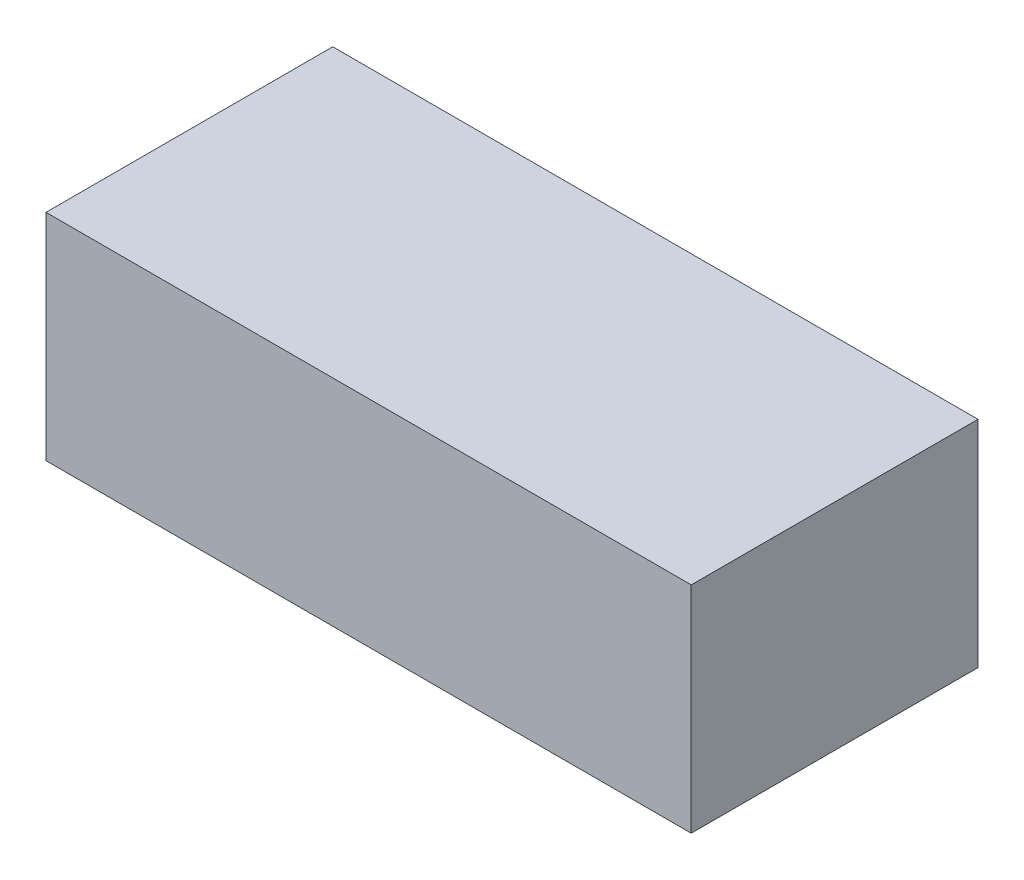
ISO-10303-21;
HEADER;
FILE_DESCRIPTION(('STEP AP214'),'2;1');
FILE_NAME('part.step','',(''),(''),'','','');
FILE_SCHEMA(('AUTOMOTIVE_DESIGN { 1 0 10303 214 1 1 1 1 }'));
ENDSEC;
DATA;
#1=APPLICATION_CONTEXT('core data for automotive mechanical design processes');
#2=APPLICATION_PROTOCOL_DEFINITION('international standard','automotive_design',2000,#1);
#3=PRODUCT_CONTEXT('',#1,'mechanical');
#4=PRODUCT('Part','Part','',(#3));
#5=PRODUCT_RELATED_PRODUCT_CATEGORY('part','',(#4));
#6=PRODUCT_DEFINITION_FORMATION('','',#4);
#7=PRODUCT_DEFINITION_CONTEXT('part definition',#1,'design');
#8=PRODUCT_DEFINITION('design','',#6,#7);
#9=PRODUCT_DEFINITION_SHAPE('','',#8);
#10=(LENGTH_UNIT() NAMED_UNIT(*) SI_UNIT(.MILLI.,.METRE.));
#11=(NAMED_UNIT(*) PLANE_ANGLE_UNIT() SI_UNIT($,.RADIAN.));
#12=(NAMED_UNIT(*) SI_UNIT($,.STERADIAN.) SOLID_ANGLE_UNIT());
#13=UNCERTAINTY_MEASURE_WITH_UNIT(LENGTH_MEASURE(1.E-05),#10,'distance_accuracy_value','');
#14=(GEOMETRIC_REPRESENTATION_CONTEXT(3) GLOBAL_UNCERTAINTY_ASSIGNED_CONTEXT((#13)) GLOBAL_UNIT_ASSIGNED_CONTEXT((#10,
#11,#12)) REPRESENTATION_CONTEXT('',''));
#15=CARTESIAN_POINT('',(0.,0.,0.));
#16=DIRECTION('',(0.,0.,1.));
#17=DIRECTION('',(1.,0.,0.));
#18=AXIS2_PLACEMENT_3D('',#15,#16,#17);
#19=CARTESIAN_POINT('',(-776.612903225806,600.,-268.548387096774));
#20=DIRECTION('',(1.,0.,0.));
#21=DIRECTION('',(0.,0.,-1.));
#22=AXIS2_PLACEMENT_3D('',#19,#20,#21);
#23=PLANE('',#22);
#24=DIRECTION('',(0.,0.,1.));
#25=VECTOR('',#24,1.);
#26=CARTESIAN_POINT('',(-776.612903225806,0.,-268.548387096774));
#27=LINE('',#26,#25);
#28=CARTESIAN_POINT('',(-776.612903225806,0.,-268.548387096774));
#29=VERTEX_POINT('',#28);
#30=CARTESIAN_POINT('',(-776.612903225806,0.,531.451612903226));
#31=VERTEX_POINT('',#30);
#32=EDGE_CURVE('E107',#29,#31,#27,.T.);
#33=ORIENTED_EDGE('',*,*,#32,.T.);
#34=DIRECTION('',(0.,-1.,0.));
#35=VECTOR('',#34,1.);
#36=CARTESIAN_POINT('',(-776.612903225806,600.,531.451612903226));
#37=LINE('',#36,#35);
#38=CARTESIAN_POINT('',(-776.612903225806,600.,531.451612903226));
#39=VERTEX_POINT('',#38);
#40=EDGE_CURVE('E11',#39,#31,#37,.T.);
#41=ORIENTED_EDGE('',*,*,#40,.F.);
#42=DIRECTION('',(0.,0.,1.));
#43=VECTOR('',#42,1.);
#44=CARTESIAN_POINT('',(-776.612903225806,600.,-268.548387096774));
#45=LINE('',#44,#43);
#46=CARTESIAN_POINT('',(-776.612903225806,600.,-268.548387096774));
#47=VERTEX_POINT('',#46);
#48=EDGE_CURVE('E91',#47,#39,#45,.T.);
#49=ORIENTED_EDGE('',*,*,#48,.F.);
#50=DIRECTION('',(0.,-1.,0.));
#51=VECTOR('',#50,1.);
#52=CARTESIAN_POINT('',(-776.612903225806,600.,-268.548387096774));
#53=LINE('',#52,#51);
#54=EDGE_CURVE('E103',#47,#29,#53,.T.);
#55=ORIENTED_EDGE('',*,*,#54,.T.);
#56=EDGE_LOOP('',(#33,#41,#49,#55));
#57=FACE_BOUND('',#56,.T.);
#58=ADVANCED_FACE('F39',(#57),#23,.F.);
#59=CARTESIAN_POINT('',(-776.612903225806,600.,531.451612903226));
#60=DIRECTION('',(0.,0.,-1.));
#61=DIRECTION('',(-1.,0.,0.));
#62=AXIS2_PLACEMENT_3D('',#59,#60,#61);
#63=PLANE('',#62);
#64=DIRECTION('',(1.,0.,0.));
#65=VECTOR('',#64,1.);
#66=CARTESIAN_POINT('',(-776.612903225806,0.,531.451612903226));
#67=LINE('',#66,#65);
#68=CARTESIAN_POINT('',(1023.38709677419,0.,531.451612903226));
#69=VERTEX_POINT('',#68);
#70=EDGE_CURVE('E96',#31,#69,#67,.T.);
#71=ORIENTED_EDGE('',*,*,#70,.T.);
#72=DIRECTION('',(0.,-1.,0.));
#73=VECTOR('',#72,1.);
#74=CARTESIAN_POINT('',(1023.38709677419,600.,531.451612903226));
#75=LINE('',#74,#73);
#76=CARTESIAN_POINT('',(1023.38709677419,600.,531.451612903226));
#77=VERTEX_POINT('',#76);
#78=EDGE_CURVE('E48',#77,#69,#75,.T.);
#79=ORIENTED_EDGE('',*,*,#78,.F.);
#80=DIRECTION('',(1.,0.,0.));
#81=VECTOR('',#80,1.);
#82=CARTESIAN_POINT('',(-776.612903225806,600.,531.451612903226));
#83=LINE('',#82,#81);
#84=EDGE_CURVE('E86',#39,#77,#83,.T.);
#85=ORIENTED_EDGE('',*,*,#84,.F.);
#86=ORIENTED_EDGE('',*,*,#40,.T.);
#87=EDGE_LOOP('',(#71,#79,#85,#86));
#88=FACE_BOUND('',#87,.T.);
#89=ADVANCED_FACE('F95',(#88),#63,.F.);
#90=CARTESIAN_POINT('',(1023.38709677419,600.,-268.548387096774));
#91=DIRECTION('',(-1.,0.,0.));
#92=DIRECTION('',(0.,0.,1.));
#93=AXIS2_PLACEMENT_3D('',#90,#91,#92);
#94=PLANE('',#93);
#95=DIRECTION('',(0.,0.,-1.));
#96=VECTOR('',#95,1.);
#97=CARTESIAN_POINT('',(1023.38709677419,0.,-268.548387096774));
#98=LINE('',#97,#96);
#99=CARTESIAN_POINT('',(1023.38709677419,0.,-268.548387096774));
#100=VERTEX_POINT('',#99);
#101=EDGE_CURVE('E73',#69,#100,#98,.T.);
#102=ORIENTED_EDGE('',*,*,#101,.T.);
#103=DIRECTION('',(0.,-1.,0.));
#104=VECTOR('',#103,1.);
#105=CARTESIAN_POINT('',(1023.38709677419,600.,-268.548387096774));
#106=LINE('',#105,#104);
#107=CARTESIAN_POINT('',(1023.38709677419,600.,-268.548387096774));
#108=VERTEX_POINT('',#107);
#109=EDGE_CURVE('E98',#108,#100,#106,.T.);
#110=ORIENTED_EDGE('',*,*,#109,.F.);
#111=DIRECTION('',(0.,0.,-1.));
#112=VECTOR('',#111,1.);
#113=CARTESIAN_POINT('',(1023.38709677419,600.,-268.548387096774));
#114=LINE('',#113,#112);
#115=EDGE_CURVE('E89',#77,#108,#114,.T.);
#116=ORIENTED_EDGE('',*,*,#115,.F.);
#117=ORIENTED_EDGE('',*,*,#78,.T.);
#118=EDGE_LOOP('',(#102,#110,#116,#117));
#119=FACE_BOUND('',#118,.T.);
#120=ADVANCED_FACE('F99',(#119),#94,.F.);
#121=CARTESIAN_POINT('',(-776.612903225806,600.,-268.548387096774));
#122=DIRECTION('',(0.,0.,1.));
#123=DIRECTION('',(1.,0.,0.));
#124=AXIS2_PLACEMENT_3D('',#121,#122,#123);
#125=PLANE('',#124);
#126=DIRECTION('',(-1.,0.,0.));
#127=VECTOR('',#126,1.);
#128=CARTESIAN_POINT('',(-776.612903225806,0.,-268.548387096774));
#129=LINE('',#128,#127);
#130=EDGE_CURVE('E79',#100,#29,#129,.T.);
#131=ORIENTED_EDGE('',*,*,#130,.T.);
#132=ORIENTED_EDGE('',*,*,#54,.F.);
#133=DIRECTION('',(-1.,0.,0.));
#134=VECTOR('',#133,1.);
#135=CARTESIAN_POINT('',(-776.612903225806,600.,-268.548387096774));
#136=LINE('',#135,#134);
#137=EDGE_CURVE('E56',#108,#47,#136,.T.);
#138=ORIENTED_EDGE('',*,*,#137,.F.);
#139=ORIENTED_EDGE('',*,*,#109,.T.);
#140=EDGE_LOOP('',(#131,#132,#138,#139));
#141=FACE_BOUND('',#140,.T.);
#142=ADVANCED_FACE('F120',(#141),#125,.F.);
#143=CARTESIAN_POINT('',(0.,600.,0.));
#144=DIRECTION('',(0.,1.,0.));
#145=DIRECTION('',(0.,0.,1.));
#146=AXIS2_PLACEMENT_3D('',#143,#144,#145);
#147=PLANE('',#146);
#148=ORIENTED_EDGE('',*,*,#48,.T.);
#149=ORIENTED_EDGE('',*,*,#84,.T.);
#150=ORIENTED_EDGE('',*,*,#115,.T.);
#151=ORIENTED_EDGE('',*,*,#137,.T.);
#152=EDGE_LOOP('',(#148,#149,#150,#151));
#153=FACE_BOUND('',#152,.T.);
#154=ADVANCED_FACE('F87',(#153),#147,.T.);
#155=CARTESIAN_POINT('',(0.,0.,0.));
#156=DIRECTION('',(0.,1.,0.));
#157=DIRECTION('',(0.,0.,1.));
#158=AXIS2_PLACEMENT_3D('',#155,#156,#157);
#159=PLANE('',#158);
#160=ORIENTED_EDGE('',*,*,#32,.F.);
#161=ORIENTED_EDGE('',*,*,#130,.F.);
#162=ORIENTED_EDGE('',*,*,#101,.F.);
#163=ORIENTED_EDGE('',*,*,#70,.F.);
#164=EDGE_LOOP('',(#160,#161,#162,#163));
#165=FACE_BOUND('',#164,.T.);
#166=ADVANCED_FACE('F123',(#165),#159,.F.);
#167=CLOSED_SHELL('',(#58,#89,#120,#142,#154,#166));
#168=MANIFOLD_SOLID_BREP('B2',#167);
#169=ADVANCED_BREP_SHAPE_REPRESENTATION('',(#18,#168),#14);
#170=SHAPE_DEFINITION_REPRESENTATION(#9,#169);
ENDSEC;
END-ISO-10303-21;
